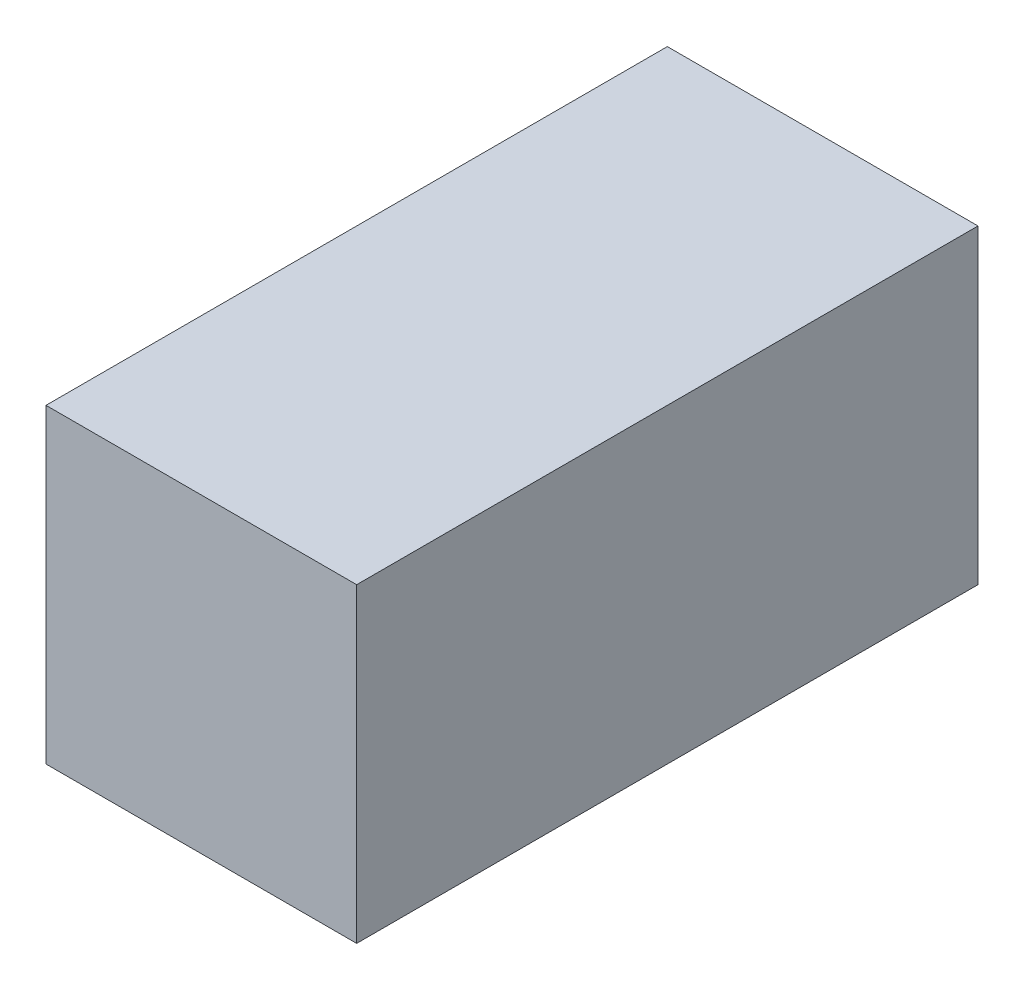
ISO-10303-21;
HEADER;
FILE_DESCRIPTION(('STEP AP214'),'2;1');
FILE_NAME('part.step','',(''),(''),'','','');
FILE_SCHEMA(('AUTOMOTIVE_DESIGN { 1 0 10303 214 1 1 1 1 }'));
ENDSEC;
DATA;
#1=APPLICATION_CONTEXT('core data for automotive mechanical design processes');
#2=APPLICATION_PROTOCOL_DEFINITION('international standard','automotive_design',2000,#1);
#3=PRODUCT_CONTEXT('',#1,'mechanical');
#4=PRODUCT('Part','Part','',(#3));
#5=PRODUCT_RELATED_PRODUCT_CATEGORY('part','',(#4));
#6=PRODUCT_DEFINITION_FORMATION('','',#4);
#7=PRODUCT_DEFINITION_CONTEXT('part definition',#1,'design');
#8=PRODUCT_DEFINITION('design','',#6,#7);
#9=PRODUCT_DEFINITION_SHAPE('','',#8);
#10=(LENGTH_UNIT() NAMED_UNIT(*) SI_UNIT(.MILLI.,.METRE.));
#11=(NAMED_UNIT(*) PLANE_ANGLE_UNIT() SI_UNIT($,.RADIAN.));
#12=(NAMED_UNIT(*) SI_UNIT($,.STERADIAN.) SOLID_ANGLE_UNIT());
#13=UNCERTAINTY_MEASURE_WITH_UNIT(LENGTH_MEASURE(1.E-05),#10,'distance_accuracy_value','');
#14=(GEOMETRIC_REPRESENTATION_CONTEXT(3) GLOBAL_UNCERTAINTY_ASSIGNED_CONTEXT((#13)) GLOBAL_UNIT_ASSIGNED_CONTEXT((#10,
#11,#12)) REPRESENTATION_CONTEXT('',''));
#15=CARTESIAN_POINT('',(0.,0.,0.));
#16=DIRECTION('',(0.,0.,1.));
#17=DIRECTION('',(1.,0.,0.));
#18=AXIS2_PLACEMENT_3D('',#15,#16,#17);
#19=CARTESIAN_POINT('',(-25.,50.,50.));
#20=DIRECTION('',(1.,0.,0.));
#21=DIRECTION('',(0.,0.,-1.));
#22=AXIS2_PLACEMENT_3D('',#19,#20,#21);
#23=PLANE('',#22);
#24=DIRECTION('',(0.,0.,1.));
#25=VECTOR('',#24,1.);
#26=CARTESIAN_POINT('',(-25.,0.,50.));
#27=LINE('',#26,#25);
#28=CARTESIAN_POINT('',(-25.,0.,-50.));
#29=VERTEX_POINT('',#28);
#30=CARTESIAN_POINT('',(-25.,0.,50.));
#31=VERTEX_POINT('',#30);
#32=EDGE_CURVE('E96',#29,#31,#27,.T.);
#33=ORIENTED_EDGE('',*,*,#32,.T.);
#34=DIRECTION('',(0.,-1.,0.));
#35=VECTOR('',#34,1.);
#36=CARTESIAN_POINT('',(-25.,50.,50.));
#37=LINE('',#36,#35);
#38=CARTESIAN_POINT('',(-25.,50.,50.));
#39=VERTEX_POINT('',#38);
#40=EDGE_CURVE('E11',#39,#31,#37,.T.);
#41=ORIENTED_EDGE('',*,*,#40,.F.);
#42=DIRECTION('',(0.,0.,1.));
#43=VECTOR('',#42,1.);
#44=CARTESIAN_POINT('',(-25.,50.,50.));
#45=LINE('',#44,#43);
#46=CARTESIAN_POINT('',(-25.,50.,-50.));
#47=VERTEX_POINT('',#46);
#48=EDGE_CURVE('E84',#47,#39,#45,.T.);
#49=ORIENTED_EDGE('',*,*,#48,.F.);
#50=DIRECTION('',(0.,-1.,0.));
#51=VECTOR('',#50,1.);
#52=CARTESIAN_POINT('',(-25.,50.,-50.));
#53=LINE('',#52,#51);
#54=EDGE_CURVE('E92',#47,#29,#53,.T.);
#55=ORIENTED_EDGE('',*,*,#54,.T.);
#56=EDGE_LOOP('',(#33,#41,#49,#55));
#57=FACE_BOUND('',#56,.T.);
#58=ADVANCED_FACE('F33',(#57),#23,.F.);
#59=CARTESIAN_POINT('',(25.,50.,50.));
#60=DIRECTION('',(0.,0.,-1.));
#61=DIRECTION('',(-1.,0.,0.));
#62=AXIS2_PLACEMENT_3D('',#59,#60,#61);
#63=PLANE('',#62);
#64=DIRECTION('',(1.,0.,0.));
#65=VECTOR('',#64,1.);
#66=CARTESIAN_POINT('',(25.,0.,50.));
#67=LINE('',#66,#65);
#68=CARTESIAN_POINT('',(25.,0.,50.));
#69=VERTEX_POINT('',#68);
#70=EDGE_CURVE('E88',#31,#69,#67,.T.);
#71=ORIENTED_EDGE('',*,*,#70,.T.);
#72=DIRECTION('',(0.,-1.,0.));
#73=VECTOR('',#72,1.);
#74=CARTESIAN_POINT('',(25.,50.,50.));
#75=LINE('',#74,#73);
#76=CARTESIAN_POINT('',(25.,50.,50.));
#77=VERTEX_POINT('',#76);
#78=EDGE_CURVE('E41',#77,#69,#75,.T.);
#79=ORIENTED_EDGE('',*,*,#78,.F.);
#80=DIRECTION('',(1.,0.,0.));
#81=VECTOR('',#80,1.);
#82=CARTESIAN_POINT('',(25.,50.,50.));
#83=LINE('',#82,#81);
#84=EDGE_CURVE('E79',#39,#77,#83,.T.);
#85=ORIENTED_EDGE('',*,*,#84,.F.);
#86=ORIENTED_EDGE('',*,*,#40,.T.);
#87=EDGE_LOOP('',(#71,#79,#85,#86));
#88=FACE_BOUND('',#87,.T.);
#89=ADVANCED_FACE('F87',(#88),#63,.F.);
#90=CARTESIAN_POINT('',(25.,50.,50.));
#91=DIRECTION('',(-1.,0.,0.));
#92=DIRECTION('',(0.,0.,1.));
#93=AXIS2_PLACEMENT_3D('',#90,#91,#92);
#94=PLANE('',#93);
#95=DIRECTION('',(0.,0.,-1.));
#96=VECTOR('',#95,1.);
#97=CARTESIAN_POINT('',(25.,0.,50.));
#98=LINE('',#97,#96);
#99=CARTESIAN_POINT('',(25.,0.,-50.));
#100=VERTEX_POINT('',#99);
#101=EDGE_CURVE('E66',#69,#100,#98,.T.);
#102=ORIENTED_EDGE('',*,*,#101,.T.);
#103=DIRECTION('',(0.,-1.,0.));
#104=VECTOR('',#103,1.);
#105=CARTESIAN_POINT('',(25.,50.,-50.));
#106=LINE('',#105,#104);
#107=CARTESIAN_POINT('',(25.,50.,-50.));
#108=VERTEX_POINT('',#107);
#109=EDGE_CURVE('E89',#108,#100,#106,.T.);
#110=ORIENTED_EDGE('',*,*,#109,.F.);
#111=DIRECTION('',(0.,0.,-1.));
#112=VECTOR('',#111,1.);
#113=CARTESIAN_POINT('',(25.,50.,50.));
#114=LINE('',#113,#112);
#115=EDGE_CURVE('E82',#77,#108,#114,.T.);
#116=ORIENTED_EDGE('',*,*,#115,.F.);
#117=ORIENTED_EDGE('',*,*,#78,.T.);
#118=EDGE_LOOP('',(#102,#110,#116,#117));
#119=FACE_BOUND('',#118,.T.);
#120=ADVANCED_FACE('F90',(#119),#94,.F.);
#121=CARTESIAN_POINT('',(25.,50.,-50.));
#122=DIRECTION('',(0.,0.,1.));
#123=DIRECTION('',(1.,0.,0.));
#124=AXIS2_PLACEMENT_3D('',#121,#122,#123);
#125=PLANE('',#124);
#126=DIRECTION('',(-1.,0.,0.));
#127=VECTOR('',#126,1.);
#128=CARTESIAN_POINT('',(25.,0.,-50.));
#129=LINE('',#128,#127);
#130=EDGE_CURVE('E72',#100,#29,#129,.T.);
#131=ORIENTED_EDGE('',*,*,#130,.T.);
#132=ORIENTED_EDGE('',*,*,#54,.F.);
#133=DIRECTION('',(-1.,0.,0.));
#134=VECTOR('',#133,1.);
#135=CARTESIAN_POINT('',(25.,50.,-50.));
#136=LINE('',#135,#134);
#137=EDGE_CURVE('E49',#108,#47,#136,.T.);
#138=ORIENTED_EDGE('',*,*,#137,.F.);
#139=ORIENTED_EDGE('',*,*,#109,.T.);
#140=EDGE_LOOP('',(#131,#132,#138,#139));
#141=FACE_BOUND('',#140,.T.);
#142=ADVANCED_FACE('F103',(#141),#125,.F.);
#143=CARTESIAN_POINT('',(0.,50.,0.));
#144=DIRECTION('',(0.,1.,0.));
#145=DIRECTION('',(0.,0.,1.));
#146=AXIS2_PLACEMENT_3D('',#143,#144,#145);
#147=PLANE('',#146);
#148=ORIENTED_EDGE('',*,*,#48,.T.);
#149=ORIENTED_EDGE('',*,*,#84,.T.);
#150=ORIENTED_EDGE('',*,*,#115,.T.);
#151=ORIENTED_EDGE('',*,*,#137,.T.);
#152=EDGE_LOOP('',(#148,#149,#150,#151));
#153=FACE_BOUND('',#152,.T.);
#154=ADVANCED_FACE('F80',(#153),#147,.T.);
#155=CARTESIAN_POINT('',(0.,0.,0.));
#156=DIRECTION('',(0.,1.,0.));
#157=DIRECTION('',(0.,0.,1.));
#158=AXIS2_PLACEMENT_3D('',#155,#156,#157);
#159=PLANE('',#158);
#160=ORIENTED_EDGE('',*,*,#32,.F.);
#161=ORIENTED_EDGE('',*,*,#130,.F.);
#162=ORIENTED_EDGE('',*,*,#101,.F.);
#163=ORIENTED_EDGE('',*,*,#70,.F.);
#164=EDGE_LOOP('',(#160,#161,#162,#163));
#165=FACE_BOUND('',#164,.T.);
#166=ADVANCED_FACE('F106',(#165),#159,.F.);
#167=CLOSED_SHELL('',(#58,#89,#120,#142,#154,#166));
#168=MANIFOLD_SOLID_BREP('B2',#167);
#169=ADVANCED_BREP_SHAPE_REPRESENTATION('',(#18,#168),#14);
#170=SHAPE_DEFINITION_REPRESENTATION(#9,#169);
ENDSEC;
END-ISO-10303-21;
